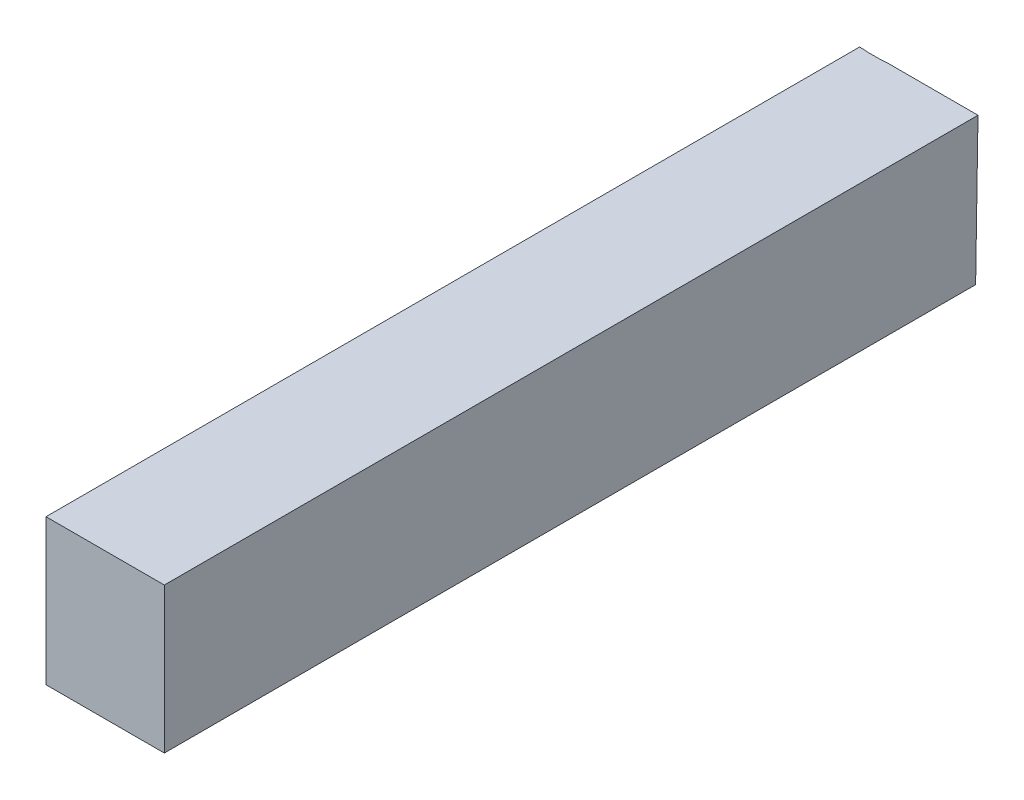
ISO-10303-21;
HEADER;
FILE_DESCRIPTION(('STEP AP214'),'2;1');
FILE_NAME('part.step','',(''),(''),'','','');
FILE_SCHEMA(('AUTOMOTIVE_DESIGN { 1 0 10303 214 1 1 1 1 }'));
ENDSEC;
DATA;
#1=APPLICATION_CONTEXT('core data for automotive mechanical design processes');
#2=APPLICATION_PROTOCOL_DEFINITION('international standard','automotive_design',2000,#1);
#3=PRODUCT_CONTEXT('',#1,'mechanical');
#4=PRODUCT('Part','Part','',(#3));
#5=PRODUCT_RELATED_PRODUCT_CATEGORY('part','',(#4));
#6=PRODUCT_DEFINITION_FORMATION('','',#4);
#7=PRODUCT_DEFINITION_CONTEXT('part definition',#1,'design');
#8=PRODUCT_DEFINITION('design','',#6,#7);
#9=PRODUCT_DEFINITION_SHAPE('','',#8);
#10=(LENGTH_UNIT() NAMED_UNIT(*) SI_UNIT(.MILLI.,.METRE.));
#11=(NAMED_UNIT(*) PLANE_ANGLE_UNIT() SI_UNIT($,.RADIAN.));
#12=(NAMED_UNIT(*) SI_UNIT($,.STERADIAN.) SOLID_ANGLE_UNIT());
#13=UNCERTAINTY_MEASURE_WITH_UNIT(LENGTH_MEASURE(1.E-05),#10,'distance_accuracy_value','');
#14=(GEOMETRIC_REPRESENTATION_CONTEXT(3) GLOBAL_UNCERTAINTY_ASSIGNED_CONTEXT((#13)) GLOBAL_UNIT_ASSIGNED_CONTEXT((#10,
#11,#12)) REPRESENTATION_CONTEXT('',''));
#15=CARTESIAN_POINT('',(0.,0.,0.));
#16=DIRECTION('',(0.,0.,1.));
#17=DIRECTION('',(1.,0.,0.));
#18=AXIS2_PLACEMENT_3D('',#15,#16,#17);
#19=CARTESIAN_POINT('',(0.,10.,0.));
#20=DIRECTION('',(0.,1.,0.));
#21=DIRECTION('',(0.,0.,1.));
#22=AXIS2_PLACEMENT_3D('',#19,#20,#21);
#23=PLANE('',#22);
#24=DIRECTION('',(-1.,0.,0.));
#25=VECTOR('',#24,1.);
#26=CARTESIAN_POINT('',(253.840928545827,9.99999999999999,141.53588771213));
#27=LINE('',#26,#25);
#28=CARTESIAN_POINT('',(139.025697562975,9.99999999999999,141.53588771213));
#29=VERTEX_POINT('',#28);
#30=CARTESIAN_POINT('',(130.896291351817,9.99999999999999,141.53588771213));
#31=VERTEX_POINT('',#30);
#32=EDGE_CURVE('E69',#29,#31,#27,.T.);
#33=ORIENTED_EDGE('',*,*,#32,.F.);
#34=DIRECTION('',(0.,0.,1.));
#35=VECTOR('',#34,1.);
#36=CARTESIAN_POINT('',(139.025697562975,9.99999999999999,85.6305725312434));
#37=LINE('',#36,#35);
#38=CARTESIAN_POINT('',(139.025697562975,9.99999999999999,85.6305725312434));
#39=VERTEX_POINT('',#38);
#40=EDGE_CURVE('E91',#39,#29,#37,.T.);
#41=ORIENTED_EDGE('',*,*,#40,.F.);
#42=DIRECTION('',(-1.,0.,0.));
#43=VECTOR('',#42,1.);
#44=CARTESIAN_POINT('',(268.719836563698,9.99999999999985,85.6305725312434));
#45=LINE('',#44,#43);
#46=CARTESIAN_POINT('',(132.819241209494,10.,85.6305725312434));
#47=VERTEX_POINT('',#46);
#48=EDGE_CURVE('E97',#39,#47,#45,.T.);
#49=ORIENTED_EDGE('',*,*,#48,.T.);
#50=CARTESIAN_POINT('',(131.857766280656,10.,74.522104321755));
#51=DIRECTION('',(0.,1.,0.));
#52=DIRECTION('',(0.,0.,1.));
#53=AXIS2_PLACEMENT_3D('',#50,#51,#52);
#54=CIRCLE('',#53,11.15);
#55=CARTESIAN_POINT('',(130.896291351817,10.,85.6305725312434));
#56=VERTEX_POINT('',#55);
#57=EDGE_CURVE('E135',#56,#47,#54,.T.);
#58=ORIENTED_EDGE('',*,*,#57,.F.);
#59=DIRECTION('',(0.,0.,-1.));
#60=VECTOR('',#59,1.);
#61=CARTESIAN_POINT('',(130.896291351817,10.,0.));
#62=LINE('',#61,#60);
#63=EDGE_CURVE('E138',#31,#56,#62,.T.);
#64=ORIENTED_EDGE('',*,*,#63,.F.);
#65=EDGE_LOOP('',(#33,#41,#49,#58,#64));
#66=FACE_BOUND('',#65,.T.);
#67=ADVANCED_FACE('F46',(#66),#23,.T.);
#68=CARTESIAN_POINT('',(0.,0.,0.));
#69=DIRECTION('',(0.,-1.,0.));
#70=DIRECTION('',(0.,0.,-1.));
#71=AXIS2_PLACEMENT_3D('',#68,#69,#70);
#72=PLANE('',#71);
#73=DIRECTION('',(-1.,0.,0.));
#74=VECTOR('',#73,1.);
#75=CARTESIAN_POINT('',(268.719836563698,-1.55288114015848E-13,85.7941987052288));
#76=LINE('',#75,#74);
#77=CARTESIAN_POINT('',(139.025697562975,0.,85.7941987052288));
#78=VERTEX_POINT('',#77);
#79=CARTESIAN_POINT('',(130.896291351817,0.,85.7941987052288));
#80=VERTEX_POINT('',#79);
#81=EDGE_CURVE('E106',#78,#80,#76,.T.);
#82=ORIENTED_EDGE('',*,*,#81,.F.);
#83=DIRECTION('',(0.,0.,1.));
#84=VECTOR('',#83,1.);
#85=CARTESIAN_POINT('',(139.025697562975,0.,85.6305725312434));
#86=LINE('',#85,#84);
#87=CARTESIAN_POINT('',(139.025697562975,0.,141.53588771213));
#88=VERTEX_POINT('',#87);
#89=EDGE_CURVE('E62',#78,#88,#86,.T.);
#90=ORIENTED_EDGE('',*,*,#89,.T.);
#91=DIRECTION('',(-1.,0.,0.));
#92=VECTOR('',#91,1.);
#93=CARTESIAN_POINT('',(268.702327491549,0.,141.53588771213));
#94=LINE('',#93,#92);
#95=CARTESIAN_POINT('',(130.896291351817,0.,141.53588771213));
#96=VERTEX_POINT('',#95);
#97=EDGE_CURVE('E132',#88,#96,#94,.T.);
#98=ORIENTED_EDGE('',*,*,#97,.T.);
#99=DIRECTION('',(0.,0.,1.));
#100=VECTOR('',#99,1.);
#101=CARTESIAN_POINT('',(130.896291351817,0.,0.));
#102=LINE('',#101,#100);
#103=EDGE_CURVE('E143',#80,#96,#102,.T.);
#104=ORIENTED_EDGE('',*,*,#103,.F.);
#105=EDGE_LOOP('',(#82,#90,#98,#104));
#106=FACE_BOUND('',#105,.T.);
#107=ADVANCED_FACE('F156',(#106),#72,.T.);
#108=CARTESIAN_POINT('',(268.702327491549,23.7639367794638,141.53588771213));
#109=DIRECTION('',(0.,0.,1.));
#110=DIRECTION('',(1.,0.,0.));
#111=AXIS2_PLACEMENT_3D('',#108,#109,#110);
#112=PLANE('',#111);
#113=ORIENTED_EDGE('',*,*,#97,.F.);
#114=DIRECTION('',(0.,1.,0.));
#115=VECTOR('',#114,1.);
#116=CARTESIAN_POINT('',(139.025697562975,9.99999999999999,141.53588771213));
#117=LINE('',#116,#115);
#118=EDGE_CURVE('E155',#88,#29,#117,.T.);
#119=ORIENTED_EDGE('',*,*,#118,.T.);
#120=ORIENTED_EDGE('',*,*,#32,.T.);
#121=DIRECTION('',(0.,1.,0.));
#122=VECTOR('',#121,1.);
#123=CARTESIAN_POINT('',(130.896291351817,23.763936779464,141.53588771213));
#124=LINE('',#123,#122);
#125=EDGE_CURVE('E139',#96,#31,#124,.T.);
#126=ORIENTED_EDGE('',*,*,#125,.F.);
#127=EDGE_LOOP('',(#113,#119,#120,#126));
#128=FACE_BOUND('',#127,.T.);
#129=ADVANCED_FACE('F154',(#128),#112,.T.);
#130=CARTESIAN_POINT('',(268.719836563698,-1.55288114015848E-13,85.7941987052288));
#131=DIRECTION('',(0.,-0.0163604274135645,-0.99986615925075));
#132=DIRECTION('',(0.,0.99986615925075,-0.0163604274135645));
#133=AXIS2_PLACEMENT_3D('',#130,#131,#132);
#134=PLANE('',#133);
#135=ORIENTED_EDGE('',*,*,#48,.F.);
#136=DIRECTION('',(0.,-0.99986615925075,0.0163604274135645));
#137=VECTOR('',#136,1.);
#138=CARTESIAN_POINT('',(139.025697562975,-1.55249000717607E-13,85.7941987052288));
#139=LINE('',#138,#137);
#140=EDGE_CURVE('E12',#39,#78,#139,.T.);
#141=ORIENTED_EDGE('',*,*,#140,.T.);
#142=ORIENTED_EDGE('',*,*,#81,.T.);
#143=DIRECTION('',(0.,-0.99986615925075,0.0163604274135645));
#144=VECTOR('',#143,1.);
#145=CARTESIAN_POINT('',(130.896291351817,0.,85.7941987052288));
#146=LINE('',#145,#144);
#147=EDGE_CURVE('E100',#56,#80,#146,.T.);
#148=ORIENTED_EDGE('',*,*,#147,.F.);
#149=CARTESIAN_POINT('',(131.857766280656,688.893109758944,74.522104321755));
#150=DIRECTION('',(0.,-0.0163604274135645,-0.99986615925075));
#151=DIRECTION('',(0.,0.99986615925075,-0.0163604274135645));
#152=AXIS2_PLACEMENT_3D('',#149,#150,#151);
#153=ELLIPSE('',#152,681.522537165226,11.15);
#154=EDGE_CURVE('E55',#56,#47,#153,.F.);
#155=ORIENTED_EDGE('',*,*,#154,.T.);
#156=EDGE_LOOP('',(#135,#141,#142,#148,#155));
#157=FACE_BOUND('',#156,.T.);
#158=ADVANCED_FACE('F102',(#157),#134,.T.);
#159=CARTESIAN_POINT('',(130.896291351817,-0.0543782899306134,-115.01));
#160=DIRECTION('',(1.,0.,0.));
#161=DIRECTION('',(0.,1.,0.));
#162=AXIS2_PLACEMENT_3D('',#159,#160,#161);
#163=PLANE('',#162);
#164=CARTESIAN_POINT('',(130.896291351817,5.38738349136346,131.340395413971));
#165=DIRECTION('',(-1.,0.,0.));
#166=DIRECTION('',(0.,0.,1.));
#167=AXIS2_PLACEMENT_3D('',#164,#165,#166);
#168=CIRCLE('',#167,3.225);
#169=CARTESIAN_POINT('',(130.896291351817,5.38738349136346,134.565395413971));
#170=VERTEX_POINT('',#169);
#171=EDGE_CURVE('E123',#170,#170,#168,.T.);
#172=ORIENTED_EDGE('',*,*,#171,.F.);
#173=EDGE_LOOP('',(#172));
#174=FACE_BOUND('',#173,.T.);
#175=CARTESIAN_POINT('',(130.896291351817,5.38738349136345,101.340395413971));
#176=DIRECTION('',(-1.,0.,0.));
#177=DIRECTION('',(0.,0.,1.));
#178=AXIS2_PLACEMENT_3D('',#175,#176,#177);
#179=CIRCLE('',#178,3.22500000000001);
#180=CARTESIAN_POINT('',(130.896291351817,5.38738349136345,104.565395413971));
#181=VERTEX_POINT('',#180);
#182=EDGE_CURVE('E115',#181,#181,#179,.T.);
#183=ORIENTED_EDGE('',*,*,#182,.F.);
#184=EDGE_LOOP('',(#183));
#185=FACE_BOUND('',#184,.T.);
#186=ORIENTED_EDGE('',*,*,#147,.T.);
#187=ORIENTED_EDGE('',*,*,#103,.T.);
#188=ORIENTED_EDGE('',*,*,#125,.T.);
#189=ORIENTED_EDGE('',*,*,#63,.T.);
#190=EDGE_LOOP('',(#186,#187,#188,#189));
#191=FACE_BOUND('',#190,.T.);
#192=ADVANCED_FACE('F48',(#174,#185,#191),#163,.F.);
#193=CARTESIAN_POINT('',(131.857766280656,5.34000000000001,74.522104321755));
#194=DIRECTION('',(0.,1.,0.));
#195=DIRECTION('',(0.,0.,1.));
#196=AXIS2_PLACEMENT_3D('',#193,#194,#195);
#197=CYLINDRICAL_SURFACE('',#196,11.15);
#198=ORIENTED_EDGE('',*,*,#154,.F.);
#199=ORIENTED_EDGE('',*,*,#57,.T.);
#200=EDGE_LOOP('',(#198,#199));
#201=FACE_BOUND('',#200,.T.);
#202=ADVANCED_FACE('F162',(#201),#197,.F.);
#203=CARTESIAN_POINT('',(133.896291351817,5.38738349136346,131.340395413971));
#204=DIRECTION('',(-1.,0.,0.));
#205=DIRECTION('',(0.,0.,1.));
#206=AXIS2_PLACEMENT_3D('',#203,#204,#205);
#207=CYLINDRICAL_SURFACE('',#206,3.225);
#208=CARTESIAN_POINT('',(133.896291351817,5.38738349136346,131.340395413971));
#209=DIRECTION('',(-1.,0.,0.));
#210=DIRECTION('',(0.,0.,1.));
#211=AXIS2_PLACEMENT_3D('',#208,#209,#210);
#212=CIRCLE('',#211,3.225);
#213=CARTESIAN_POINT('',(133.896291351817,5.38738349136346,134.565395413971));
#214=VERTEX_POINT('',#213);
#215=EDGE_CURVE('E110',#214,#214,#212,.T.);
#216=ORIENTED_EDGE('',*,*,#215,.F.);
#217=EDGE_LOOP('',(#216));
#218=FACE_BOUND('',#217,.T.);
#219=ORIENTED_EDGE('',*,*,#171,.T.);
#220=EDGE_LOOP('',(#219));
#221=FACE_BOUND('',#220,.T.);
#222=ADVANCED_FACE('F164',(#218,#221),#207,.F.);
#223=CARTESIAN_POINT('',(133.896291351817,5.38738349136346,131.340395413971));
#224=DIRECTION('',(-1.,0.,0.));
#225=DIRECTION('',(0.,0.,1.));
#226=AXIS2_PLACEMENT_3D('',#223,#224,#225);
#227=PLANE('',#226);
#228=ORIENTED_EDGE('',*,*,#215,.T.);
#229=EDGE_LOOP('',(#228));
#230=FACE_BOUND('',#229,.T.);
#231=ADVANCED_FACE('F171',(#230),#227,.T.);
#232=CARTESIAN_POINT('',(133.896291351817,5.38738349136345,101.340395413971));
#233=DIRECTION('',(-1.,0.,0.));
#234=DIRECTION('',(0.,0.,1.));
#235=AXIS2_PLACEMENT_3D('',#232,#233,#234);
#236=CYLINDRICAL_SURFACE('',#235,3.22500000000001);
#237=CARTESIAN_POINT('',(133.896291351817,5.38738349136345,101.340395413971));
#238=DIRECTION('',(-1.,0.,0.));
#239=DIRECTION('',(0.,0.,1.));
#240=AXIS2_PLACEMENT_3D('',#237,#238,#239);
#241=CIRCLE('',#240,3.22500000000001);
#242=CARTESIAN_POINT('',(133.896291351817,5.38738349136345,104.565395413971));
#243=VERTEX_POINT('',#242);
#244=EDGE_CURVE('E119',#243,#243,#241,.T.);
#245=ORIENTED_EDGE('',*,*,#244,.F.);
#246=EDGE_LOOP('',(#245));
#247=FACE_BOUND('',#246,.T.);
#248=ORIENTED_EDGE('',*,*,#182,.T.);
#249=EDGE_LOOP('',(#248));
#250=FACE_BOUND('',#249,.T.);
#251=ADVANCED_FACE('F189',(#247,#250),#236,.F.);
#252=CARTESIAN_POINT('',(133.896291351817,5.38738349136345,101.340395413971));
#253=DIRECTION('',(-1.,0.,0.));
#254=DIRECTION('',(0.,0.,1.));
#255=AXIS2_PLACEMENT_3D('',#252,#253,#254);
#256=PLANE('',#255);
#257=ORIENTED_EDGE('',*,*,#244,.T.);
#258=EDGE_LOOP('',(#257));
#259=FACE_BOUND('',#258,.T.);
#260=ADVANCED_FACE('F192',(#259),#256,.T.);
#261=CARTESIAN_POINT('',(139.025697562975,9.99999999999999,85.6305725312434));
#262=DIRECTION('',(1.,0.,0.));
#263=DIRECTION('',(0.,0.,-1.));
#264=AXIS2_PLACEMENT_3D('',#261,#262,#263);
#265=PLANE('',#264);
#266=ORIENTED_EDGE('',*,*,#40,.T.);
#267=ORIENTED_EDGE('',*,*,#118,.F.);
#268=ORIENTED_EDGE('',*,*,#89,.F.);
#269=ORIENTED_EDGE('',*,*,#140,.F.);
#270=EDGE_LOOP('',(#266,#267,#268,#269));
#271=FACE_BOUND('',#270,.T.);
#272=ADVANCED_FACE('F90',(#271),#265,.T.);
#273=CLOSED_SHELL('',(#67,#107,#129,#158,#192,#202,#222,#231,#251,#260,#272));
#274=MANIFOLD_SOLID_BREP('B2',#273);
#275=ADVANCED_BREP_SHAPE_REPRESENTATION('',(#18,#274),#14);
#276=SHAPE_DEFINITION_REPRESENTATION(#9,#275);
ENDSEC;
END-ISO-10303-21;
